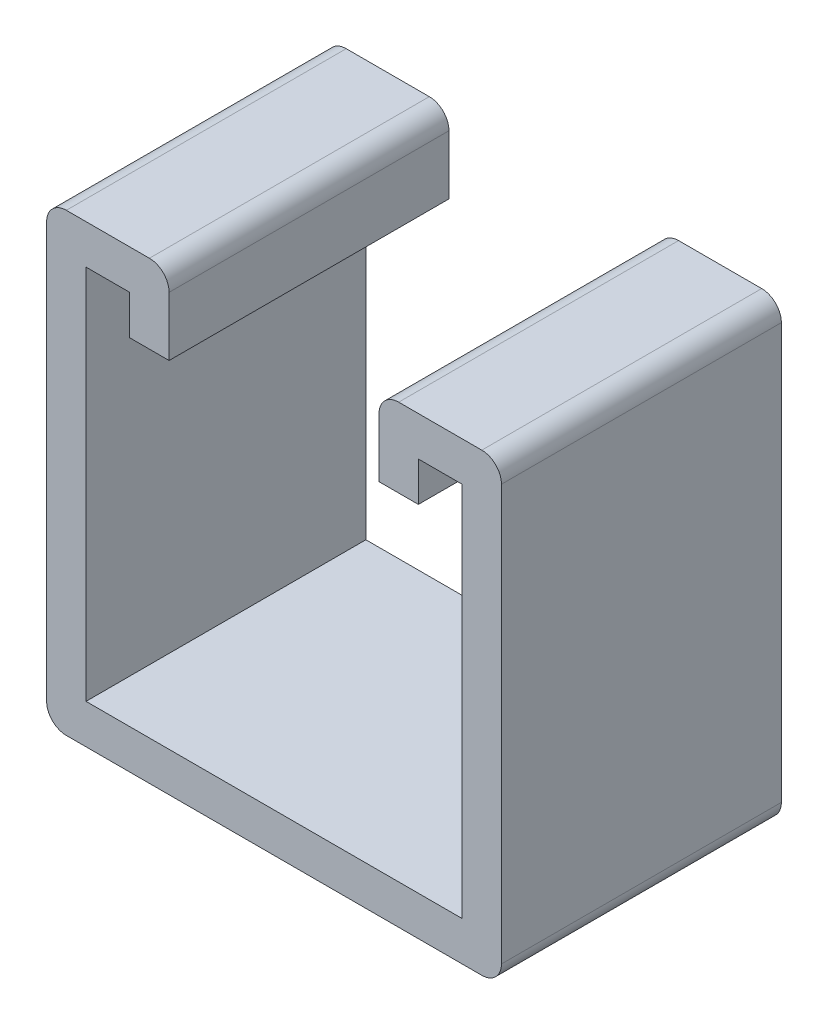
ISO-10303-21;
HEADER;
FILE_DESCRIPTION(('STEP AP214'),'2;1');
FILE_NAME('part.step','',(''),(''),'','','');
FILE_SCHEMA(('AUTOMOTIVE_DESIGN { 1 0 10303 214 1 1 1 1 }'));
ENDSEC;
DATA;
#1=APPLICATION_CONTEXT('core data for automotive mechanical design processes');
#2=APPLICATION_PROTOCOL_DEFINITION('international standard','automotive_design',2000,#1);
#3=PRODUCT_CONTEXT('',#1,'mechanical');
#4=PRODUCT('Part','Part','',(#3));
#5=PRODUCT_RELATED_PRODUCT_CATEGORY('part','',(#4));
#6=PRODUCT_DEFINITION_FORMATION('','',#4);
#7=PRODUCT_DEFINITION_CONTEXT('part definition',#1,'design');
#8=PRODUCT_DEFINITION('design','',#6,#7);
#9=PRODUCT_DEFINITION_SHAPE('','',#8);
#10=(LENGTH_UNIT() NAMED_UNIT(*) SI_UNIT(.MILLI.,.METRE.));
#11=(NAMED_UNIT(*) PLANE_ANGLE_UNIT() SI_UNIT($,.RADIAN.));
#12=(NAMED_UNIT(*) SI_UNIT($,.STERADIAN.) SOLID_ANGLE_UNIT());
#13=UNCERTAINTY_MEASURE_WITH_UNIT(LENGTH_MEASURE(1.E-05),#10,'distance_accuracy_value','');
#14=(GEOMETRIC_REPRESENTATION_CONTEXT(3) GLOBAL_UNCERTAINTY_ASSIGNED_CONTEXT((#13)) GLOBAL_UNIT_ASSIGNED_CONTEXT((#10,
#11,#12)) REPRESENTATION_CONTEXT('',''));
#15=CARTESIAN_POINT('',(0.,0.,0.));
#16=DIRECTION('',(0.,0.,1.));
#17=DIRECTION('',(1.,0.,0.));
#18=AXIS2_PLACEMENT_3D('',#15,#16,#17);
#19=CARTESIAN_POINT('',(9.525,13.49375,12.7));
#20=DIRECTION('',(0.,1.,0.));
#21=DIRECTION('',(0.,0.,1.));
#22=AXIS2_PLACEMENT_3D('',#19,#20,#21);
#23=PLANE('',#22);
#24=DIRECTION('',(1.,0.,0.));
#25=VECTOR('',#24,1.);
#26=CARTESIAN_POINT('',(9.525,13.49375,-12.7));
#27=LINE('',#26,#25);
#28=CARTESIAN_POINT('',(9.525,13.49375,-12.7));
#29=VERTEX_POINT('',#28);
#30=CARTESIAN_POINT('',(13.096875,13.49375,-12.7));
#31=VERTEX_POINT('',#30);
#32=EDGE_CURVE('E212',#29,#31,#27,.T.);
#33=ORIENTED_EDGE('',*,*,#32,.T.);
#34=DIRECTION('',(0.,0.,-1.));
#35=VECTOR('',#34,1.);
#36=CARTESIAN_POINT('',(13.096875,13.49375,12.7));
#37=LINE('',#36,#35);
#38=CARTESIAN_POINT('',(13.096875,13.49375,12.7));
#39=VERTEX_POINT('',#38);
#40=EDGE_CURVE('E11',#39,#31,#37,.T.);
#41=ORIENTED_EDGE('',*,*,#40,.F.);
#42=DIRECTION('',(1.,0.,0.));
#43=VECTOR('',#42,1.);
#44=CARTESIAN_POINT('',(9.525,13.49375,12.7));
#45=LINE('',#44,#43);
#46=CARTESIAN_POINT('',(9.525,13.49375,12.7));
#47=VERTEX_POINT('',#46);
#48=EDGE_CURVE('E254',#47,#39,#45,.T.);
#49=ORIENTED_EDGE('',*,*,#48,.F.);
#50=DIRECTION('',(0.,0.,-1.));
#51=VECTOR('',#50,1.);
#52=CARTESIAN_POINT('',(9.525,13.49375,12.7));
#53=LINE('',#52,#51);
#54=EDGE_CURVE('E208',#47,#29,#53,.T.);
#55=ORIENTED_EDGE('',*,*,#54,.T.);
#56=EDGE_LOOP('',(#33,#41,#49,#55));
#57=FACE_BOUND('',#56,.T.);
#58=ADVANCED_FACE('F32',(#57),#23,.F.);
#59=CARTESIAN_POINT('',(13.096875,17.065625,12.7));
#60=DIRECTION('',(-1.,0.,0.));
#61=DIRECTION('',(0.,0.,1.));
#62=AXIS2_PLACEMENT_3D('',#59,#60,#61);
#63=PLANE('',#62);
#64=DIRECTION('',(0.,1.,0.));
#65=VECTOR('',#64,1.);
#66=CARTESIAN_POINT('',(13.096875,17.065625,-12.7));
#67=LINE('',#66,#65);
#68=CARTESIAN_POINT('',(13.096875,17.065625,-12.7));
#69=VERTEX_POINT('',#68);
#70=EDGE_CURVE('E215',#31,#69,#67,.T.);
#71=ORIENTED_EDGE('',*,*,#70,.T.);
#72=DIRECTION('',(0.,0.,-1.));
#73=VECTOR('',#72,1.);
#74=CARTESIAN_POINT('',(13.096875,17.065625,12.7));
#75=LINE('',#74,#73);
#76=CARTESIAN_POINT('',(13.096875,17.065625,12.7));
#77=VERTEX_POINT('',#76);
#78=EDGE_CURVE('E40',#77,#69,#75,.T.);
#79=ORIENTED_EDGE('',*,*,#78,.F.);
#80=DIRECTION('',(0.,1.,0.));
#81=VECTOR('',#80,1.);
#82=CARTESIAN_POINT('',(13.096875,17.065625,12.7));
#83=LINE('',#82,#81);
#84=EDGE_CURVE('E133',#39,#77,#83,.T.);
#85=ORIENTED_EDGE('',*,*,#84,.F.);
#86=ORIENTED_EDGE('',*,*,#40,.T.);
#87=EDGE_LOOP('',(#71,#79,#85,#86));
#88=FACE_BOUND('',#87,.T.);
#89=ADVANCED_FACE('F382',(#88),#63,.F.);
#90=CARTESIAN_POINT('',(17.065625,17.065625,12.7));
#91=DIRECTION('',(0.,1.,0.));
#92=DIRECTION('',(0.,0.,1.));
#93=AXIS2_PLACEMENT_3D('',#90,#91,#92);
#94=PLANE('',#93);
#95=DIRECTION('',(1.,0.,0.));
#96=VECTOR('',#95,1.);
#97=CARTESIAN_POINT('',(17.065625,17.065625,-12.7));
#98=LINE('',#97,#96);
#99=CARTESIAN_POINT('',(17.065625,17.065625,-12.7));
#100=VERTEX_POINT('',#99);
#101=EDGE_CURVE('E217',#69,#100,#98,.T.);
#102=ORIENTED_EDGE('',*,*,#101,.T.);
#103=DIRECTION('',(0.,0.,-1.));
#104=VECTOR('',#103,1.);
#105=CARTESIAN_POINT('',(17.065625,17.065625,12.7));
#106=LINE('',#105,#104);
#107=CARTESIAN_POINT('',(17.065625,17.065625,12.7));
#108=VERTEX_POINT('',#107);
#109=EDGE_CURVE('E303',#108,#100,#106,.T.);
#110=ORIENTED_EDGE('',*,*,#109,.F.);
#111=DIRECTION('',(1.,0.,0.));
#112=VECTOR('',#111,1.);
#113=CARTESIAN_POINT('',(17.065625,17.065625,12.7));
#114=LINE('',#113,#112);
#115=EDGE_CURVE('E311',#77,#108,#114,.T.);
#116=ORIENTED_EDGE('',*,*,#115,.F.);
#117=ORIENTED_EDGE('',*,*,#78,.T.);
#118=EDGE_LOOP('',(#102,#110,#116,#117));
#119=FACE_BOUND('',#118,.T.);
#120=ADVANCED_FACE('F309',(#119),#94,.F.);
#121=CARTESIAN_POINT('',(17.065625,-17.065625,12.7));
#122=DIRECTION('',(1.,0.,0.));
#123=DIRECTION('',(0.,0.,-1.));
#124=AXIS2_PLACEMENT_3D('',#121,#122,#123);
#125=PLANE('',#124);
#126=DIRECTION('',(0.,-1.,0.));
#127=VECTOR('',#126,1.);
#128=CARTESIAN_POINT('',(17.065625,-17.065625,-12.7));
#129=LINE('',#128,#127);
#130=CARTESIAN_POINT('',(17.065625,-17.065625,-12.7));
#131=VERTEX_POINT('',#130);
#132=EDGE_CURVE('E219',#100,#131,#129,.T.);
#133=ORIENTED_EDGE('',*,*,#132,.T.);
#134=DIRECTION('',(0.,0.,-1.));
#135=VECTOR('',#134,1.);
#136=CARTESIAN_POINT('',(17.065625,-17.065625,12.7));
#137=LINE('',#136,#135);
#138=CARTESIAN_POINT('',(17.065625,-17.065625,12.7));
#139=VERTEX_POINT('',#138);
#140=EDGE_CURVE('E300',#139,#131,#137,.T.);
#141=ORIENTED_EDGE('',*,*,#140,.F.);
#142=DIRECTION('',(0.,-1.,0.));
#143=VECTOR('',#142,1.);
#144=CARTESIAN_POINT('',(17.065625,-17.065625,12.7));
#145=LINE('',#144,#143);
#146=EDGE_CURVE('E329',#108,#139,#145,.T.);
#147=ORIENTED_EDGE('',*,*,#146,.F.);
#148=ORIENTED_EDGE('',*,*,#109,.T.);
#149=EDGE_LOOP('',(#133,#141,#147,#148));
#150=FACE_BOUND('',#149,.T.);
#151=ADVANCED_FACE('F320',(#150),#125,.F.);
#152=CARTESIAN_POINT('',(-17.065625,-17.065625,12.7));
#153=DIRECTION('',(0.,-1.,0.));
#154=DIRECTION('',(0.,0.,-1.));
#155=AXIS2_PLACEMENT_3D('',#152,#153,#154);
#156=PLANE('',#155);
#157=DIRECTION('',(-1.,0.,0.));
#158=VECTOR('',#157,1.);
#159=CARTESIAN_POINT('',(-17.065625,-17.065625,-12.7));
#160=LINE('',#159,#158);
#161=CARTESIAN_POINT('',(-17.065625,-17.065625,-12.7));
#162=VERTEX_POINT('',#161);
#163=EDGE_CURVE('E221',#131,#162,#160,.T.);
#164=ORIENTED_EDGE('',*,*,#163,.T.);
#165=DIRECTION('',(0.,0.,-1.));
#166=VECTOR('',#165,1.);
#167=CARTESIAN_POINT('',(-17.065625,-17.065625,12.7));
#168=LINE('',#167,#166);
#169=CARTESIAN_POINT('',(-17.065625,-17.065625,12.7));
#170=VERTEX_POINT('',#169);
#171=EDGE_CURVE('E297',#170,#162,#168,.T.);
#172=ORIENTED_EDGE('',*,*,#171,.F.);
#173=DIRECTION('',(-1.,0.,0.));
#174=VECTOR('',#173,1.);
#175=CARTESIAN_POINT('',(-17.065625,-17.065625,12.7));
#176=LINE('',#175,#174);
#177=EDGE_CURVE('E326',#139,#170,#176,.T.);
#178=ORIENTED_EDGE('',*,*,#177,.F.);
#179=ORIENTED_EDGE('',*,*,#140,.T.);
#180=EDGE_LOOP('',(#164,#172,#178,#179));
#181=FACE_BOUND('',#180,.T.);
#182=ADVANCED_FACE('F324',(#181),#156,.F.);
#183=CARTESIAN_POINT('',(-17.065625,17.065625,12.7));
#184=DIRECTION('',(-1.,0.,0.));
#185=DIRECTION('',(0.,0.,1.));
#186=AXIS2_PLACEMENT_3D('',#183,#184,#185);
#187=PLANE('',#186);
#188=DIRECTION('',(0.,1.,0.));
#189=VECTOR('',#188,1.);
#190=CARTESIAN_POINT('',(-17.065625,17.065625,-12.7));
#191=LINE('',#190,#189);
#192=CARTESIAN_POINT('',(-17.065625,17.065625,-12.7));
#193=VERTEX_POINT('',#192);
#194=EDGE_CURVE('E223',#162,#193,#191,.T.);
#195=ORIENTED_EDGE('',*,*,#194,.T.);
#196=DIRECTION('',(0.,0.,-1.));
#197=VECTOR('',#196,1.);
#198=CARTESIAN_POINT('',(-17.065625,17.065625,12.7));
#199=LINE('',#198,#197);
#200=CARTESIAN_POINT('',(-17.065625,17.065625,12.7));
#201=VERTEX_POINT('',#200);
#202=EDGE_CURVE('E294',#201,#193,#199,.T.);
#203=ORIENTED_EDGE('',*,*,#202,.F.);
#204=DIRECTION('',(0.,1.,0.));
#205=VECTOR('',#204,1.);
#206=CARTESIAN_POINT('',(-17.065625,17.065625,12.7));
#207=LINE('',#206,#205);
#208=EDGE_CURVE('E328',#170,#201,#207,.T.);
#209=ORIENTED_EDGE('',*,*,#208,.F.);
#210=ORIENTED_EDGE('',*,*,#171,.T.);
#211=EDGE_LOOP('',(#195,#203,#209,#210));
#212=FACE_BOUND('',#211,.T.);
#213=ADVANCED_FACE('F395',(#212),#187,.F.);
#214=CARTESIAN_POINT('',(-13.096875,17.065625,12.7));
#215=DIRECTION('',(0.,1.,0.));
#216=DIRECTION('',(-1.,0.,0.));
#217=AXIS2_PLACEMENT_3D('',#214,#215,#216);
#218=PLANE('',#217);
#219=DIRECTION('',(1.,0.,0.));
#220=VECTOR('',#219,1.);
#221=CARTESIAN_POINT('',(-13.096875,17.065625,-12.7));
#222=LINE('',#221,#220);
#223=CARTESIAN_POINT('',(-13.096875,17.065625,-12.7));
#224=VERTEX_POINT('',#223);
#225=EDGE_CURVE('E225',#193,#224,#222,.T.);
#226=ORIENTED_EDGE('',*,*,#225,.T.);
#227=DIRECTION('',(0.,0.,-1.));
#228=VECTOR('',#227,1.);
#229=CARTESIAN_POINT('',(-13.096875,17.065625,12.7));
#230=LINE('',#229,#228);
#231=CARTESIAN_POINT('',(-13.096875,17.065625,12.7));
#232=VERTEX_POINT('',#231);
#233=EDGE_CURVE('E291',#232,#224,#230,.T.);
#234=ORIENTED_EDGE('',*,*,#233,.F.);
#235=DIRECTION('',(1.,0.,0.));
#236=VECTOR('',#235,1.);
#237=CARTESIAN_POINT('',(-13.096875,17.065625,12.7));
#238=LINE('',#237,#236);
#239=EDGE_CURVE('E331',#201,#232,#238,.T.);
#240=ORIENTED_EDGE('',*,*,#239,.F.);
#241=ORIENTED_EDGE('',*,*,#202,.T.);
#242=EDGE_LOOP('',(#226,#234,#240,#241));
#243=FACE_BOUND('',#242,.T.);
#244=ADVANCED_FACE('F398',(#243),#218,.F.);
#245=CARTESIAN_POINT('',(-13.096875,17.065625,12.7));
#246=DIRECTION('',(1.,0.,0.));
#247=DIRECTION('',(0.,0.,-1.));
#248=AXIS2_PLACEMENT_3D('',#245,#246,#247);
#249=PLANE('',#248);
#250=DIRECTION('',(0.,-1.,0.));
#251=VECTOR('',#250,1.);
#252=CARTESIAN_POINT('',(-13.096875,17.065625,-12.7));
#253=LINE('',#252,#251);
#254=CARTESIAN_POINT('',(-13.096875,13.49375,-12.7));
#255=VERTEX_POINT('',#254);
#256=EDGE_CURVE('E227',#224,#255,#253,.T.);
#257=ORIENTED_EDGE('',*,*,#256,.T.);
#258=DIRECTION('',(0.,0.,-1.));
#259=VECTOR('',#258,1.);
#260=CARTESIAN_POINT('',(-13.096875,13.49375,12.7));
#261=LINE('',#260,#259);
#262=CARTESIAN_POINT('',(-13.096875,13.49375,12.7));
#263=VERTEX_POINT('',#262);
#264=EDGE_CURVE('E288',#263,#255,#261,.T.);
#265=ORIENTED_EDGE('',*,*,#264,.F.);
#266=DIRECTION('',(0.,-1.,0.));
#267=VECTOR('',#266,1.);
#268=CARTESIAN_POINT('',(-13.096875,17.065625,12.7));
#269=LINE('',#268,#267);
#270=EDGE_CURVE('E337',#232,#263,#269,.T.);
#271=ORIENTED_EDGE('',*,*,#270,.F.);
#272=ORIENTED_EDGE('',*,*,#233,.T.);
#273=EDGE_LOOP('',(#257,#265,#271,#272));
#274=FACE_BOUND('',#273,.T.);
#275=ADVANCED_FACE('F402',(#274),#249,.F.);
#276=CARTESIAN_POINT('',(-13.096875,13.49375,12.7));
#277=DIRECTION('',(0.,1.,0.));
#278=DIRECTION('',(-1.,0.,0.));
#279=AXIS2_PLACEMENT_3D('',#276,#277,#278);
#280=PLANE('',#279);
#281=DIRECTION('',(1.,0.,0.));
#282=VECTOR('',#281,1.);
#283=CARTESIAN_POINT('',(-13.096875,13.49375,-12.7));
#284=LINE('',#283,#282);
#285=CARTESIAN_POINT('',(-9.525,13.49375,-12.7));
#286=VERTEX_POINT('',#285);
#287=EDGE_CURVE('E229',#255,#286,#284,.T.);
#288=ORIENTED_EDGE('',*,*,#287,.T.);
#289=DIRECTION('',(0.,0.,-1.));
#290=VECTOR('',#289,1.);
#291=CARTESIAN_POINT('',(-9.525,13.49375,12.7));
#292=LINE('',#291,#290);
#293=CARTESIAN_POINT('',(-9.525,13.49375,12.7));
#294=VERTEX_POINT('',#293);
#295=EDGE_CURVE('E285',#294,#286,#292,.T.);
#296=ORIENTED_EDGE('',*,*,#295,.F.);
#297=DIRECTION('',(1.,0.,0.));
#298=VECTOR('',#297,1.);
#299=CARTESIAN_POINT('',(-13.096875,13.49375,12.7));
#300=LINE('',#299,#298);
#301=EDGE_CURVE('E339',#263,#294,#300,.T.);
#302=ORIENTED_EDGE('',*,*,#301,.F.);
#303=ORIENTED_EDGE('',*,*,#264,.T.);
#304=EDGE_LOOP('',(#288,#296,#302,#303));
#305=FACE_BOUND('',#304,.T.);
#306=ADVANCED_FACE('F406',(#305),#280,.F.);
#307=CARTESIAN_POINT('',(-9.525,18.8515625,12.7));
#308=DIRECTION('',(-1.,0.,0.));
#309=DIRECTION('',(0.,-1.,0.));
#310=AXIS2_PLACEMENT_3D('',#307,#308,#309);
#311=PLANE('',#310);
#312=DIRECTION('',(0.,1.,0.));
#313=VECTOR('',#312,1.);
#314=CARTESIAN_POINT('',(-9.525,18.8515625,-12.7));
#315=LINE('',#314,#313);
#316=CARTESIAN_POINT('',(-9.525,18.8515625,-12.7));
#317=VERTEX_POINT('',#316);
#318=EDGE_CURVE('E231',#286,#317,#315,.T.);
#319=ORIENTED_EDGE('',*,*,#318,.T.);
#320=DIRECTION('',(0.,0.,-1.));
#321=VECTOR('',#320,1.);
#322=CARTESIAN_POINT('',(-9.525,18.8515625,12.7));
#323=LINE('',#322,#321);
#324=CARTESIAN_POINT('',(-9.525,18.8515625,12.7));
#325=VERTEX_POINT('',#324);
#326=EDGE_CURVE('E282',#325,#317,#323,.T.);
#327=ORIENTED_EDGE('',*,*,#326,.F.);
#328=DIRECTION('',(0.,1.,0.));
#329=VECTOR('',#328,1.);
#330=CARTESIAN_POINT('',(-9.525,18.8515625,12.7));
#331=LINE('',#330,#329);
#332=EDGE_CURVE('E341',#294,#325,#331,.T.);
#333=ORIENTED_EDGE('',*,*,#332,.F.);
#334=ORIENTED_EDGE('',*,*,#295,.T.);
#335=EDGE_LOOP('',(#319,#327,#333,#334));
#336=FACE_BOUND('',#335,.T.);
#337=ADVANCED_FACE('F410',(#336),#311,.F.);
#338=CARTESIAN_POINT('',(-11.3109375,18.8515625,12.7));
#339=DIRECTION('',(0.,0.,-1.));
#340=DIRECTION('',(-1.,0.,0.));
#341=AXIS2_PLACEMENT_3D('',#338,#339,#340);
#342=CYLINDRICAL_SURFACE('',#341,1.7859375);
#343=CARTESIAN_POINT('',(-11.3109375,18.8515625,-12.7));
#344=DIRECTION('',(0.,0.,1.));
#345=DIRECTION('',(-1.,0.,0.));
#346=AXIS2_PLACEMENT_3D('',#343,#344,#345);
#347=CIRCLE('',#346,1.7859375);
#348=CARTESIAN_POINT('',(-11.3109375,20.6375,-12.7));
#349=VERTEX_POINT('',#348);
#350=EDGE_CURVE('E233',#317,#349,#347,.T.);
#351=ORIENTED_EDGE('',*,*,#350,.T.);
#352=DIRECTION('',(0.,0.,-1.));
#353=VECTOR('',#352,1.);
#354=CARTESIAN_POINT('',(-11.3109375,20.6375,12.7));
#355=LINE('',#354,#353);
#356=CARTESIAN_POINT('',(-11.3109375,20.6375,12.7));
#357=VERTEX_POINT('',#356);
#358=EDGE_CURVE('E279',#357,#349,#355,.T.);
#359=ORIENTED_EDGE('',*,*,#358,.F.);
#360=CARTESIAN_POINT('',(-11.3109375,18.8515625,12.7));
#361=DIRECTION('',(0.,0.,1.));
#362=DIRECTION('',(-1.,0.,0.));
#363=AXIS2_PLACEMENT_3D('',#360,#361,#362);
#364=CIRCLE('',#363,1.7859375);
#365=EDGE_CURVE('E343',#325,#357,#364,.T.);
#366=ORIENTED_EDGE('',*,*,#365,.F.);
#367=ORIENTED_EDGE('',*,*,#326,.T.);
#368=EDGE_LOOP('',(#351,#359,#366,#367));
#369=FACE_BOUND('',#368,.T.);
#370=ADVANCED_FACE('F414',(#369),#342,.T.);
#371=CARTESIAN_POINT('',(-11.3109375,20.6375,12.7));
#372=DIRECTION('',(0.,-1.,0.));
#373=DIRECTION('',(1.,0.,0.));
#374=AXIS2_PLACEMENT_3D('',#371,#372,#373);
#375=PLANE('',#374);
#376=DIRECTION('',(-1.,0.,0.));
#377=VECTOR('',#376,1.);
#378=CARTESIAN_POINT('',(-11.3109375,20.6375,-12.7));
#379=LINE('',#378,#377);
#380=CARTESIAN_POINT('',(-18.8515625,20.6375,-12.7));
#381=VERTEX_POINT('',#380);
#382=EDGE_CURVE('E235',#349,#381,#379,.T.);
#383=ORIENTED_EDGE('',*,*,#382,.T.);
#384=DIRECTION('',(0.,0.,-1.));
#385=VECTOR('',#384,1.);
#386=CARTESIAN_POINT('',(-18.8515625,20.6375,12.7));
#387=LINE('',#386,#385);
#388=CARTESIAN_POINT('',(-18.8515625,20.6375,12.7));
#389=VERTEX_POINT('',#388);
#390=EDGE_CURVE('E276',#389,#381,#387,.T.);
#391=ORIENTED_EDGE('',*,*,#390,.F.);
#392=DIRECTION('',(-1.,0.,0.));
#393=VECTOR('',#392,1.);
#394=CARTESIAN_POINT('',(-11.3109375,20.6375,12.7));
#395=LINE('',#394,#393);
#396=EDGE_CURVE('E345',#357,#389,#395,.T.);
#397=ORIENTED_EDGE('',*,*,#396,.F.);
#398=ORIENTED_EDGE('',*,*,#358,.T.);
#399=EDGE_LOOP('',(#383,#391,#397,#398));
#400=FACE_BOUND('',#399,.T.);
#401=ADVANCED_FACE('F418',(#400),#375,.F.);
#402=CARTESIAN_POINT('',(-18.8515625,18.8515625,12.7));
#403=DIRECTION('',(0.,0.,-1.));
#404=DIRECTION('',(-1.,0.,0.));
#405=AXIS2_PLACEMENT_3D('',#402,#403,#404);
#406=CYLINDRICAL_SURFACE('',#405,1.7859375);
#407=CARTESIAN_POINT('',(-18.8515625,18.8515625,-12.7));
#408=DIRECTION('',(0.,0.,1.));
#409=DIRECTION('',(-1.,0.,0.));
#410=AXIS2_PLACEMENT_3D('',#407,#408,#409);
#411=CIRCLE('',#410,1.7859375);
#412=CARTESIAN_POINT('',(-20.6375,18.8515625,-12.7));
#413=VERTEX_POINT('',#412);
#414=EDGE_CURVE('E237',#381,#413,#411,.T.);
#415=ORIENTED_EDGE('',*,*,#414,.T.);
#416=DIRECTION('',(0.,0.,-1.));
#417=VECTOR('',#416,1.);
#418=CARTESIAN_POINT('',(-20.6375,18.8515625,12.7));
#419=LINE('',#418,#417);
#420=CARTESIAN_POINT('',(-20.6375,18.8515625,12.7));
#421=VERTEX_POINT('',#420);
#422=EDGE_CURVE('E273',#421,#413,#419,.T.);
#423=ORIENTED_EDGE('',*,*,#422,.F.);
#424=CARTESIAN_POINT('',(-18.8515625,18.8515625,12.7));
#425=DIRECTION('',(0.,0.,1.));
#426=DIRECTION('',(-1.,0.,0.));
#427=AXIS2_PLACEMENT_3D('',#424,#425,#426);
#428=CIRCLE('',#427,1.7859375);
#429=EDGE_CURVE('E347',#389,#421,#428,.T.);
#430=ORIENTED_EDGE('',*,*,#429,.F.);
#431=ORIENTED_EDGE('',*,*,#390,.T.);
#432=EDGE_LOOP('',(#415,#423,#430,#431));
#433=FACE_BOUND('',#432,.T.);
#434=ADVANCED_FACE('F422',(#433),#406,.T.);
#435=CARTESIAN_POINT('',(-20.6375,18.8515625,12.7));
#436=DIRECTION('',(1.,0.,0.));
#437=DIRECTION('',(0.,1.,0.));
#438=AXIS2_PLACEMENT_3D('',#435,#436,#437);
#439=PLANE('',#438);
#440=DIRECTION('',(0.,-1.,0.));
#441=VECTOR('',#440,1.);
#442=CARTESIAN_POINT('',(-20.6375,18.8515625,-12.7));
#443=LINE('',#442,#441);
#444=CARTESIAN_POINT('',(-20.6375,-18.8515625,-12.7));
#445=VERTEX_POINT('',#444);
#446=EDGE_CURVE('E239',#413,#445,#443,.T.);
#447=ORIENTED_EDGE('',*,*,#446,.T.);
#448=DIRECTION('',(0.,0.,-1.));
#449=VECTOR('',#448,1.);
#450=CARTESIAN_POINT('',(-20.6375,-18.8515625,12.7));
#451=LINE('',#450,#449);
#452=CARTESIAN_POINT('',(-20.6375,-18.8515625,12.7));
#453=VERTEX_POINT('',#452);
#454=EDGE_CURVE('E270',#453,#445,#451,.T.);
#455=ORIENTED_EDGE('',*,*,#454,.F.);
#456=DIRECTION('',(0.,-1.,0.));
#457=VECTOR('',#456,1.);
#458=CARTESIAN_POINT('',(-20.6375,18.8515625,12.7));
#459=LINE('',#458,#457);
#460=EDGE_CURVE('E349',#421,#453,#459,.T.);
#461=ORIENTED_EDGE('',*,*,#460,.F.);
#462=ORIENTED_EDGE('',*,*,#422,.T.);
#463=EDGE_LOOP('',(#447,#455,#461,#462));
#464=FACE_BOUND('',#463,.T.);
#465=ADVANCED_FACE('F426',(#464),#439,.F.);
#466=CARTESIAN_POINT('',(-18.8515625,-18.8515625,12.7));
#467=DIRECTION('',(0.,0.,-1.));
#468=DIRECTION('',(-1.,0.,0.));
#469=AXIS2_PLACEMENT_3D('',#466,#467,#468);
#470=CYLINDRICAL_SURFACE('',#469,1.7859375);
#471=CARTESIAN_POINT('',(-18.8515625,-18.8515625,-12.7));
#472=DIRECTION('',(0.,0.,1.));
#473=DIRECTION('',(-1.,0.,0.));
#474=AXIS2_PLACEMENT_3D('',#471,#472,#473);
#475=CIRCLE('',#474,1.7859375);
#476=CARTESIAN_POINT('',(-18.8515625,-20.6375,-12.7));
#477=VERTEX_POINT('',#476);
#478=EDGE_CURVE('E241',#445,#477,#475,.T.);
#479=ORIENTED_EDGE('',*,*,#478,.T.);
#480=DIRECTION('',(0.,0.,-1.));
#481=VECTOR('',#480,1.);
#482=CARTESIAN_POINT('',(-18.8515625,-20.6375,12.7));
#483=LINE('',#482,#481);
#484=CARTESIAN_POINT('',(-18.8515625,-20.6375,12.7));
#485=VERTEX_POINT('',#484);
#486=EDGE_CURVE('E267',#485,#477,#483,.T.);
#487=ORIENTED_EDGE('',*,*,#486,.F.);
#488=CARTESIAN_POINT('',(-18.8515625,-18.8515625,12.7));
#489=DIRECTION('',(0.,0.,1.));
#490=DIRECTION('',(-1.,0.,0.));
#491=AXIS2_PLACEMENT_3D('',#488,#489,#490);
#492=CIRCLE('',#491,1.7859375);
#493=EDGE_CURVE('E351',#453,#485,#492,.T.);
#494=ORIENTED_EDGE('',*,*,#493,.F.);
#495=ORIENTED_EDGE('',*,*,#454,.T.);
#496=EDGE_LOOP('',(#479,#487,#494,#495));
#497=FACE_BOUND('',#496,.T.);
#498=ADVANCED_FACE('F430',(#497),#470,.T.);
#499=CARTESIAN_POINT('',(-18.8515625,-20.6375,12.7));
#500=DIRECTION('',(0.,1.,0.));
#501=DIRECTION('',(-1.,0.,0.));
#502=AXIS2_PLACEMENT_3D('',#499,#500,#501);
#503=PLANE('',#502);
#504=DIRECTION('',(1.,0.,0.));
#505=VECTOR('',#504,1.);
#506=CARTESIAN_POINT('',(-18.8515625,-20.6375,-12.7));
#507=LINE('',#506,#505);
#508=CARTESIAN_POINT('',(18.8515625,-20.6375,-12.7));
#509=VERTEX_POINT('',#508);
#510=EDGE_CURVE('E243',#477,#509,#507,.T.);
#511=ORIENTED_EDGE('',*,*,#510,.T.);
#512=DIRECTION('',(0.,0.,-1.));
#513=VECTOR('',#512,1.);
#514=CARTESIAN_POINT('',(18.8515625,-20.6375,12.7));
#515=LINE('',#514,#513);
#516=CARTESIAN_POINT('',(18.8515625,-20.6375,12.7));
#517=VERTEX_POINT('',#516);
#518=EDGE_CURVE('E264',#517,#509,#515,.T.);
#519=ORIENTED_EDGE('',*,*,#518,.F.);
#520=DIRECTION('',(1.,0.,0.));
#521=VECTOR('',#520,1.);
#522=CARTESIAN_POINT('',(-18.8515625,-20.6375,12.7));
#523=LINE('',#522,#521);
#524=EDGE_CURVE('E353',#485,#517,#523,.T.);
#525=ORIENTED_EDGE('',*,*,#524,.F.);
#526=ORIENTED_EDGE('',*,*,#486,.T.);
#527=EDGE_LOOP('',(#511,#519,#525,#526));
#528=FACE_BOUND('',#527,.T.);
#529=ADVANCED_FACE('F434',(#528),#503,.F.);
#530=CARTESIAN_POINT('',(18.8515625,-18.8515625,12.7));
#531=DIRECTION('',(0.,0.,-1.));
#532=DIRECTION('',(-1.,0.,0.));
#533=AXIS2_PLACEMENT_3D('',#530,#531,#532);
#534=CYLINDRICAL_SURFACE('',#533,1.7859375);
#535=CARTESIAN_POINT('',(18.8515625,-18.8515625,-12.7));
#536=DIRECTION('',(0.,0.,1.));
#537=DIRECTION('',(-1.,0.,0.));
#538=AXIS2_PLACEMENT_3D('',#535,#536,#537);
#539=CIRCLE('',#538,1.7859375);
#540=CARTESIAN_POINT('',(20.6375,-18.8515625,-12.7));
#541=VERTEX_POINT('',#540);
#542=EDGE_CURVE('E245',#509,#541,#539,.T.);
#543=ORIENTED_EDGE('',*,*,#542,.T.);
#544=DIRECTION('',(0.,0.,-1.));
#545=VECTOR('',#544,1.);
#546=CARTESIAN_POINT('',(20.6375,-18.8515625,12.7));
#547=LINE('',#546,#545);
#548=CARTESIAN_POINT('',(20.6375,-18.8515625,12.7));
#549=VERTEX_POINT('',#548);
#550=EDGE_CURVE('E261',#549,#541,#547,.T.);
#551=ORIENTED_EDGE('',*,*,#550,.F.);
#552=CARTESIAN_POINT('',(18.8515625,-18.8515625,12.7));
#553=DIRECTION('',(0.,0.,1.));
#554=DIRECTION('',(-1.,0.,0.));
#555=AXIS2_PLACEMENT_3D('',#552,#553,#554);
#556=CIRCLE('',#555,1.7859375);
#557=EDGE_CURVE('E355',#517,#549,#556,.T.);
#558=ORIENTED_EDGE('',*,*,#557,.F.);
#559=ORIENTED_EDGE('',*,*,#518,.T.);
#560=EDGE_LOOP('',(#543,#551,#558,#559));
#561=FACE_BOUND('',#560,.T.);
#562=ADVANCED_FACE('F438',(#561),#534,.T.);
#563=CARTESIAN_POINT('',(20.6375,-18.8515625,12.7));
#564=DIRECTION('',(-1.,0.,0.));
#565=DIRECTION('',(0.,-1.,0.));
#566=AXIS2_PLACEMENT_3D('',#563,#564,#565);
#567=PLANE('',#566);
#568=DIRECTION('',(0.,1.,0.));
#569=VECTOR('',#568,1.);
#570=CARTESIAN_POINT('',(20.6375,-18.8515625,-12.7));
#571=LINE('',#570,#569);
#572=CARTESIAN_POINT('',(20.6375,18.8515625,-12.7));
#573=VERTEX_POINT('',#572);
#574=EDGE_CURVE('E247',#541,#573,#571,.T.);
#575=ORIENTED_EDGE('',*,*,#574,.T.);
#576=DIRECTION('',(0.,0.,-1.));
#577=VECTOR('',#576,1.);
#578=CARTESIAN_POINT('',(20.6375,18.8515625,12.7));
#579=LINE('',#578,#577);
#580=CARTESIAN_POINT('',(20.6375,18.8515625,12.7));
#581=VERTEX_POINT('',#580);
#582=EDGE_CURVE('E258',#581,#573,#579,.T.);
#583=ORIENTED_EDGE('',*,*,#582,.F.);
#584=DIRECTION('',(0.,1.,0.));
#585=VECTOR('',#584,1.);
#586=CARTESIAN_POINT('',(20.6375,-18.8515625,12.7));
#587=LINE('',#586,#585);
#588=EDGE_CURVE('E357',#549,#581,#587,.T.);
#589=ORIENTED_EDGE('',*,*,#588,.F.);
#590=ORIENTED_EDGE('',*,*,#550,.T.);
#591=EDGE_LOOP('',(#575,#583,#589,#590));
#592=FACE_BOUND('',#591,.T.);
#593=ADVANCED_FACE('F363',(#592),#567,.F.);
#594=CARTESIAN_POINT('',(18.8515625,18.8515625,12.7));
#595=DIRECTION('',(0.,0.,-1.));
#596=DIRECTION('',(-1.,0.,0.));
#597=AXIS2_PLACEMENT_3D('',#594,#595,#596);
#598=CYLINDRICAL_SURFACE('',#597,1.7859375);
#599=CARTESIAN_POINT('',(18.8515625,18.8515625,-12.7));
#600=DIRECTION('',(0.,0.,1.));
#601=DIRECTION('',(-1.,0.,0.));
#602=AXIS2_PLACEMENT_3D('',#599,#600,#601);
#603=CIRCLE('',#602,1.7859375);
#604=CARTESIAN_POINT('',(18.8515625,20.6375,-12.7));
#605=VERTEX_POINT('',#604);
#606=EDGE_CURVE('E249',#573,#605,#603,.T.);
#607=ORIENTED_EDGE('',*,*,#606,.T.);
#608=DIRECTION('',(0.,0.,-1.));
#609=VECTOR('',#608,1.);
#610=CARTESIAN_POINT('',(18.8515625,20.6375,12.7));
#611=LINE('',#610,#609);
#612=CARTESIAN_POINT('',(18.8515625,20.6375,12.7));
#613=VERTEX_POINT('',#612);
#614=EDGE_CURVE('E203',#613,#605,#611,.T.);
#615=ORIENTED_EDGE('',*,*,#614,.F.);
#616=CARTESIAN_POINT('',(18.8515625,18.8515625,12.7));
#617=DIRECTION('',(0.,0.,1.));
#618=DIRECTION('',(-1.,0.,0.));
#619=AXIS2_PLACEMENT_3D('',#616,#617,#618);
#620=CIRCLE('',#619,1.7859375);
#621=EDGE_CURVE('E194',#581,#613,#620,.T.);
#622=ORIENTED_EDGE('',*,*,#621,.F.);
#623=ORIENTED_EDGE('',*,*,#582,.T.);
#624=EDGE_LOOP('',(#607,#615,#622,#623));
#625=FACE_BOUND('',#624,.T.);
#626=ADVANCED_FACE('F367',(#625),#598,.T.);
#627=CARTESIAN_POINT('',(18.8515625,20.6375,12.7));
#628=DIRECTION('',(0.,-1.,0.));
#629=DIRECTION('',(0.,0.,-1.));
#630=AXIS2_PLACEMENT_3D('',#627,#628,#629);
#631=PLANE('',#630);
#632=DIRECTION('',(-1.,0.,0.));
#633=VECTOR('',#632,1.);
#634=CARTESIAN_POINT('',(18.8515625,20.6375,-12.7));
#635=LINE('',#634,#633);
#636=CARTESIAN_POINT('',(11.3109375,20.6375,-12.7));
#637=VERTEX_POINT('',#636);
#638=EDGE_CURVE('E202',#605,#637,#635,.T.);
#639=ORIENTED_EDGE('',*,*,#638,.T.);
#640=DIRECTION('',(0.,0.,-1.));
#641=VECTOR('',#640,1.);
#642=CARTESIAN_POINT('',(11.3109375,20.6375,12.7));
#643=LINE('',#642,#641);
#644=CARTESIAN_POINT('',(11.3109375,20.6375,12.7));
#645=VERTEX_POINT('',#644);
#646=EDGE_CURVE('E199',#645,#637,#643,.T.);
#647=ORIENTED_EDGE('',*,*,#646,.F.);
#648=DIRECTION('',(-1.,0.,0.));
#649=VECTOR('',#648,1.);
#650=CARTESIAN_POINT('',(18.8515625,20.6375,12.7));
#651=LINE('',#650,#649);
#652=EDGE_CURVE('E188',#613,#645,#651,.T.);
#653=ORIENTED_EDGE('',*,*,#652,.F.);
#654=ORIENTED_EDGE('',*,*,#614,.T.);
#655=EDGE_LOOP('',(#639,#647,#653,#654));
#656=FACE_BOUND('',#655,.T.);
#657=ADVANCED_FACE('F200',(#656),#631,.F.);
#658=CARTESIAN_POINT('',(11.3109375,18.8515625,12.7));
#659=DIRECTION('',(0.,0.,-1.));
#660=DIRECTION('',(-1.,0.,0.));
#661=AXIS2_PLACEMENT_3D('',#658,#659,#660);
#662=CYLINDRICAL_SURFACE('',#661,1.7859375);
#663=CARTESIAN_POINT('',(11.3109375,18.8515625,-12.7));
#664=DIRECTION('',(0.,0.,1.));
#665=DIRECTION('',(-1.,0.,0.));
#666=AXIS2_PLACEMENT_3D('',#663,#664,#665);
#667=CIRCLE('',#666,1.7859375);
#668=CARTESIAN_POINT('',(9.525,18.8515625,-12.7));
#669=VERTEX_POINT('',#668);
#670=EDGE_CURVE('E119',#637,#669,#667,.T.);
#671=ORIENTED_EDGE('',*,*,#670,.T.);
#672=DIRECTION('',(0.,0.,-1.));
#673=VECTOR('',#672,1.);
#674=CARTESIAN_POINT('',(9.525,18.8515625,12.7));
#675=LINE('',#674,#673);
#676=CARTESIAN_POINT('',(9.525,18.8515625,12.7));
#677=VERTEX_POINT('',#676);
#678=EDGE_CURVE('E204',#677,#669,#675,.T.);
#679=ORIENTED_EDGE('',*,*,#678,.F.);
#680=CARTESIAN_POINT('',(11.3109375,18.8515625,12.7));
#681=DIRECTION('',(0.,0.,1.));
#682=DIRECTION('',(-1.,0.,0.));
#683=AXIS2_PLACEMENT_3D('',#680,#681,#682);
#684=CIRCLE('',#683,1.7859375);
#685=EDGE_CURVE('E192',#645,#677,#684,.T.);
#686=ORIENTED_EDGE('',*,*,#685,.F.);
#687=ORIENTED_EDGE('',*,*,#646,.T.);
#688=EDGE_LOOP('',(#671,#679,#686,#687));
#689=FACE_BOUND('',#688,.T.);
#690=ADVANCED_FACE('F206',(#689),#662,.T.);
#691=CARTESIAN_POINT('',(9.525,18.8515625,12.7));
#692=DIRECTION('',(1.,0.,0.));
#693=DIRECTION('',(0.,1.,0.));
#694=AXIS2_PLACEMENT_3D('',#691,#692,#693);
#695=PLANE('',#694);
#696=DIRECTION('',(0.,-1.,0.));
#697=VECTOR('',#696,1.);
#698=CARTESIAN_POINT('',(9.525,18.8515625,-12.7));
#699=LINE('',#698,#697);
#700=EDGE_CURVE('E125',#669,#29,#699,.T.);
#701=ORIENTED_EDGE('',*,*,#700,.T.);
#702=ORIENTED_EDGE('',*,*,#54,.F.);
#703=DIRECTION('',(0.,-1.,0.));
#704=VECTOR('',#703,1.);
#705=CARTESIAN_POINT('',(9.525,18.8515625,12.7));
#706=LINE('',#705,#704);
#707=EDGE_CURVE('E48',#677,#47,#706,.T.);
#708=ORIENTED_EDGE('',*,*,#707,.F.);
#709=ORIENTED_EDGE('',*,*,#678,.T.);
#710=EDGE_LOOP('',(#701,#702,#708,#709));
#711=FACE_BOUND('',#710,.T.);
#712=ADVANCED_FACE('F371',(#711),#695,.F.);
#713=CARTESIAN_POINT('',(-11.3109375,18.8515625,12.7));
#714=DIRECTION('',(0.,0.,-1.));
#715=DIRECTION('',(-1.,0.,0.));
#716=AXIS2_PLACEMENT_3D('',#713,#714,#715);
#717=PLANE('',#716);
#718=ORIENTED_EDGE('',*,*,#48,.T.);
#719=ORIENTED_EDGE('',*,*,#84,.T.);
#720=ORIENTED_EDGE('',*,*,#115,.T.);
#721=ORIENTED_EDGE('',*,*,#146,.T.);
#722=ORIENTED_EDGE('',*,*,#177,.T.);
#723=ORIENTED_EDGE('',*,*,#208,.T.);
#724=ORIENTED_EDGE('',*,*,#239,.T.);
#725=ORIENTED_EDGE('',*,*,#270,.T.);
#726=ORIENTED_EDGE('',*,*,#301,.T.);
#727=ORIENTED_EDGE('',*,*,#332,.T.);
#728=ORIENTED_EDGE('',*,*,#365,.T.);
#729=ORIENTED_EDGE('',*,*,#396,.T.);
#730=ORIENTED_EDGE('',*,*,#429,.T.);
#731=ORIENTED_EDGE('',*,*,#460,.T.);
#732=ORIENTED_EDGE('',*,*,#493,.T.);
#733=ORIENTED_EDGE('',*,*,#524,.T.);
#734=ORIENTED_EDGE('',*,*,#557,.T.);
#735=ORIENTED_EDGE('',*,*,#588,.T.);
#736=ORIENTED_EDGE('',*,*,#621,.T.);
#737=ORIENTED_EDGE('',*,*,#652,.T.);
#738=ORIENTED_EDGE('',*,*,#685,.T.);
#739=ORIENTED_EDGE('',*,*,#707,.T.);
#740=EDGE_LOOP('',(#718,#719,#720,#721,#722,#723,#724,#725,#726,#727,#728,#729,#730,#731,#732,
#733,#734,#735,#736,#737,#738,#739));
#741=FACE_BOUND('',#740,.T.);
#742=ADVANCED_FACE('F190',(#741),#717,.F.);
#743=CARTESIAN_POINT('',(-11.3109375,18.8515625,-12.7));
#744=DIRECTION('',(0.,0.,-1.));
#745=DIRECTION('',(-1.,0.,0.));
#746=AXIS2_PLACEMENT_3D('',#743,#744,#745);
#747=PLANE('',#746);
#748=ORIENTED_EDGE('',*,*,#32,.F.);
#749=ORIENTED_EDGE('',*,*,#700,.F.);
#750=ORIENTED_EDGE('',*,*,#670,.F.);
#751=ORIENTED_EDGE('',*,*,#638,.F.);
#752=ORIENTED_EDGE('',*,*,#606,.F.);
#753=ORIENTED_EDGE('',*,*,#574,.F.);
#754=ORIENTED_EDGE('',*,*,#542,.F.);
#755=ORIENTED_EDGE('',*,*,#510,.F.);
#756=ORIENTED_EDGE('',*,*,#478,.F.);
#757=ORIENTED_EDGE('',*,*,#446,.F.);
#758=ORIENTED_EDGE('',*,*,#414,.F.);
#759=ORIENTED_EDGE('',*,*,#382,.F.);
#760=ORIENTED_EDGE('',*,*,#350,.F.);
#761=ORIENTED_EDGE('',*,*,#318,.F.);
#762=ORIENTED_EDGE('',*,*,#287,.F.);
#763=ORIENTED_EDGE('',*,*,#256,.F.);
#764=ORIENTED_EDGE('',*,*,#225,.F.);
#765=ORIENTED_EDGE('',*,*,#194,.F.);
#766=ORIENTED_EDGE('',*,*,#163,.F.);
#767=ORIENTED_EDGE('',*,*,#132,.F.);
#768=ORIENTED_EDGE('',*,*,#101,.F.);
#769=ORIENTED_EDGE('',*,*,#70,.F.);
#770=EDGE_LOOP('',(#748,#749,#750,#751,#752,#753,#754,#755,#756,#757,#758,#759,#760,#761,#762,
#763,#764,#765,#766,#767,#768,#769));
#771=FACE_BOUND('',#770,.T.);
#772=ADVANCED_FACE('F315',(#771),#747,.T.);
#773=CLOSED_SHELL('',(#58,#89,#120,#151,#182,#213,#244,#275,#306,#337,#370,#401,#434,#465,#498,
#529,#562,#593,#626,#657,#690,#712,#742,#772));
#774=MANIFOLD_SOLID_BREP('B2',#773);
#775=ADVANCED_BREP_SHAPE_REPRESENTATION('',(#18,#774),#14);
#776=SHAPE_DEFINITION_REPRESENTATION(#9,#775);
ENDSEC;
END-ISO-10303-21;
